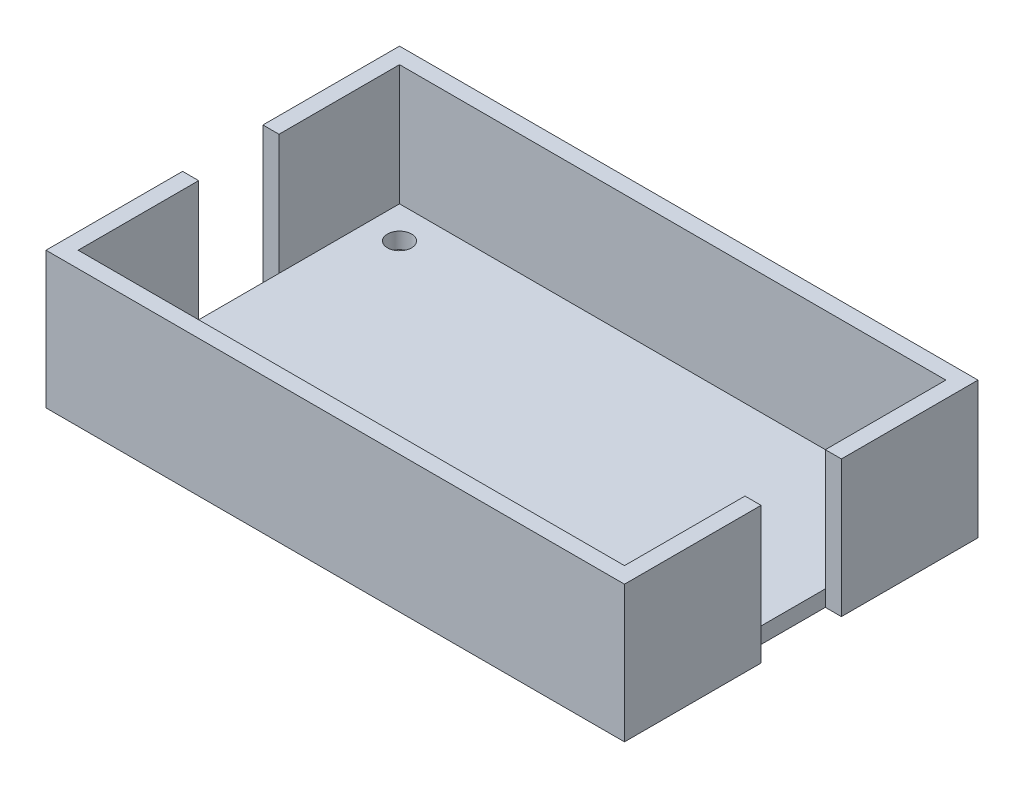
ISO-10303-21;
HEADER;
FILE_DESCRIPTION(('STEP AP214'),'2;1');
FILE_NAME('part.step','',(''),(''),'','','');
FILE_SCHEMA(('AUTOMOTIVE_DESIGN { 1 0 10303 214 1 1 1 1 }'));
ENDSEC;
DATA;
#1=APPLICATION_CONTEXT('core data for automotive mechanical design processes');
#2=APPLICATION_PROTOCOL_DEFINITION('international standard','automotive_design',2000,#1);
#3=PRODUCT_CONTEXT('',#1,'mechanical');
#4=PRODUCT('Part','Part','',(#3));
#5=PRODUCT_RELATED_PRODUCT_CATEGORY('part','',(#4));
#6=PRODUCT_DEFINITION_FORMATION('','',#4);
#7=PRODUCT_DEFINITION_CONTEXT('part definition',#1,'design');
#8=PRODUCT_DEFINITION('design','',#6,#7);
#9=PRODUCT_DEFINITION_SHAPE('','',#8);
#10=(LENGTH_UNIT() NAMED_UNIT(*) SI_UNIT(.MILLI.,.METRE.));
#11=(NAMED_UNIT(*) PLANE_ANGLE_UNIT() SI_UNIT($,.RADIAN.));
#12=(NAMED_UNIT(*) SI_UNIT($,.STERADIAN.) SOLID_ANGLE_UNIT());
#13=UNCERTAINTY_MEASURE_WITH_UNIT(LENGTH_MEASURE(1.E-05),#10,'distance_accuracy_value','');
#14=(GEOMETRIC_REPRESENTATION_CONTEXT(3) GLOBAL_UNCERTAINTY_ASSIGNED_CONTEXT((#13)) GLOBAL_UNIT_ASSIGNED_CONTEXT((#10,
#11,#12)) REPRESENTATION_CONTEXT('',''));
#15=CARTESIAN_POINT('',(0.,0.,0.));
#16=DIRECTION('',(0.,0.,1.));
#17=DIRECTION('',(1.,0.,0.));
#18=AXIS2_PLACEMENT_3D('',#15,#16,#17);
#19=CARTESIAN_POINT('',(72.,15.,0.));
#20=DIRECTION('',(1.,0.,0.));
#21=DIRECTION('',(0.,0.,-1.));
#22=AXIS2_PLACEMENT_3D('',#19,#20,#21);
#23=PLANE('',#22);
#24=DIRECTION('',(0.,-1.,0.));
#25=VECTOR('',#24,1.);
#26=CARTESIAN_POINT('',(72.,15.,27.));
#27=LINE('',#26,#25);
#28=CARTESIAN_POINT('',(72.,15.,27.));
#29=VERTEX_POINT('',#28);
#30=CARTESIAN_POINT('',(72.,-2.,27.));
#31=VERTEX_POINT('',#30);
#32=EDGE_CURVE('E324',#29,#31,#27,.T.);
#33=ORIENTED_EDGE('',*,*,#32,.F.);
#34=DIRECTION('',(0.,0.,1.));
#35=VECTOR('',#34,1.);
#36=CARTESIAN_POINT('',(72.,15.,0.));
#37=LINE('',#36,#35);
#38=CARTESIAN_POINT('',(72.,15.,44.));
#39=VERTEX_POINT('',#38);
#40=EDGE_CURVE('E263',#29,#39,#37,.T.);
#41=ORIENTED_EDGE('',*,*,#40,.T.);
#42=DIRECTION('',(0.,-1.,0.));
#43=VECTOR('',#42,1.);
#44=CARTESIAN_POINT('',(72.,15.,44.));
#45=LINE('',#44,#43);
#46=CARTESIAN_POINT('',(72.,-2.,44.));
#47=VERTEX_POINT('',#46);
#48=EDGE_CURVE('E287',#39,#47,#45,.T.);
#49=ORIENTED_EDGE('',*,*,#48,.T.);
#50=DIRECTION('',(0.,0.,1.));
#51=VECTOR('',#50,1.);
#52=CARTESIAN_POINT('',(72.,-2.,0.));
#53=LINE('',#52,#51);
#54=EDGE_CURVE('E237',#31,#47,#53,.T.);
#55=ORIENTED_EDGE('',*,*,#54,.F.);
#56=EDGE_LOOP('',(#33,#41,#49,#55));
#57=FACE_BOUND('',#56,.T.);
#58=ADVANCED_FACE('F35',(#57),#23,.T.);
#59=CARTESIAN_POINT('',(70.,15.,0.));
#60=DIRECTION('',(-1.,0.,0.));
#61=DIRECTION('',(0.,0.,1.));
#62=AXIS2_PLACEMENT_3D('',#59,#60,#61);
#63=PLANE('',#62);
#64=DIRECTION('',(0.,-1.,0.));
#65=VECTOR('',#64,1.);
#66=CARTESIAN_POINT('',(70.,15.,27.));
#67=LINE('',#66,#65);
#68=CARTESIAN_POINT('',(70.,15.,27.));
#69=VERTEX_POINT('',#68);
#70=CARTESIAN_POINT('',(70.,0.,27.));
#71=VERTEX_POINT('',#70);
#72=EDGE_CURVE('E179',#69,#71,#67,.T.);
#73=ORIENTED_EDGE('',*,*,#72,.T.);
#74=DIRECTION('',(0.,0.,-1.));
#75=VECTOR('',#74,1.);
#76=CARTESIAN_POINT('',(70.,0.,0.));
#77=LINE('',#76,#75);
#78=CARTESIAN_POINT('',(70.,0.,42.));
#79=VERTEX_POINT('',#78);
#80=EDGE_CURVE('E298',#79,#71,#77,.T.);
#81=ORIENTED_EDGE('',*,*,#80,.F.);
#82=DIRECTION('',(0.,-1.,0.));
#83=VECTOR('',#82,1.);
#84=CARTESIAN_POINT('',(70.,15.,42.));
#85=LINE('',#84,#83);
#86=CARTESIAN_POINT('',(70.,15.,42.));
#87=VERTEX_POINT('',#86);
#88=EDGE_CURVE('E301',#87,#79,#85,.T.);
#89=ORIENTED_EDGE('',*,*,#88,.F.);
#90=DIRECTION('',(0.,0.,-1.));
#91=VECTOR('',#90,1.);
#92=CARTESIAN_POINT('',(70.,15.,0.));
#93=LINE('',#92,#91);
#94=EDGE_CURVE('E284',#87,#69,#93,.T.);
#95=ORIENTED_EDGE('',*,*,#94,.T.);
#96=EDGE_LOOP('',(#73,#81,#89,#95));
#97=FACE_BOUND('',#96,.T.);
#98=ADVANCED_FACE('F388',(#97),#63,.T.);
#99=CARTESIAN_POINT('',(0.,15.,0.));
#100=DIRECTION('',(0.,1.,0.));
#101=DIRECTION('',(0.,0.,1.));
#102=AXIS2_PLACEMENT_3D('',#99,#100,#101);
#103=PLANE('',#102);
#104=DIRECTION('',(1.,0.,0.));
#105=VECTOR('',#104,1.);
#106=CARTESIAN_POINT('',(70.,15.,27.));
#107=LINE('',#106,#105);
#108=EDGE_CURVE('E189',#69,#29,#107,.T.);
#109=ORIENTED_EDGE('',*,*,#108,.F.);
#110=ORIENTED_EDGE('',*,*,#94,.F.);
#111=DIRECTION('',(-1.,0.,0.));
#112=VECTOR('',#111,1.);
#113=CARTESIAN_POINT('',(0.,15.,42.));
#114=LINE('',#113,#112);
#115=CARTESIAN_POINT('',(2.,15.,42.));
#116=VERTEX_POINT('',#115);
#117=EDGE_CURVE('E273',#87,#116,#114,.T.);
#118=ORIENTED_EDGE('',*,*,#117,.T.);
#119=DIRECTION('',(0.,0.,-1.));
#120=VECTOR('',#119,1.);
#121=CARTESIAN_POINT('',(2.,15.,0.));
#122=LINE('',#121,#120);
#123=CARTESIAN_POINT('',(2.,15.,27.));
#124=VERTEX_POINT('',#123);
#125=EDGE_CURVE('E277',#116,#124,#122,.T.);
#126=ORIENTED_EDGE('',*,*,#125,.T.);
#127=DIRECTION('',(-1.,0.,0.));
#128=VECTOR('',#127,1.);
#129=CARTESIAN_POINT('',(2.,15.,27.));
#130=LINE('',#129,#128);
#131=CARTESIAN_POINT('',(0.,15.,27.));
#132=VERTEX_POINT('',#131);
#133=EDGE_CURVE('E215',#124,#132,#130,.T.);
#134=ORIENTED_EDGE('',*,*,#133,.T.);
#135=DIRECTION('',(0.,0.,1.));
#136=VECTOR('',#135,1.);
#137=CARTESIAN_POINT('',(0.,15.,0.));
#138=LINE('',#137,#136);
#139=CARTESIAN_POINT('',(0.,15.,44.));
#140=VERTEX_POINT('',#139);
#141=EDGE_CURVE('E266',#132,#140,#138,.T.);
#142=ORIENTED_EDGE('',*,*,#141,.T.);
#143=DIRECTION('',(1.,0.,0.));
#144=VECTOR('',#143,1.);
#145=CARTESIAN_POINT('',(0.,15.,44.));
#146=LINE('',#145,#144);
#147=EDGE_CURVE('E270',#140,#39,#146,.T.);
#148=ORIENTED_EDGE('',*,*,#147,.T.);
#149=ORIENTED_EDGE('',*,*,#40,.F.);
#150=EDGE_LOOP('',(#109,#110,#118,#126,#134,#142,#148,#149));
#151=FACE_BOUND('',#150,.T.);
#152=ADVANCED_FACE('F337',(#151),#103,.T.);
#153=CARTESIAN_POINT('',(2.,15.,0.));
#154=DIRECTION('',(-1.,0.,0.));
#155=DIRECTION('',(0.,0.,1.));
#156=AXIS2_PLACEMENT_3D('',#153,#154,#155);
#157=PLANE('',#156);
#158=CARTESIAN_POINT('',(2.,15.,17.));
#159=VERTEX_POINT('',#158);
#160=CARTESIAN_POINT('',(2.,15.,2.00000000000001));
#161=VERTEX_POINT('',#160);
#162=EDGE_CURVE('E276',#159,#161,#122,.T.);
#163=ORIENTED_EDGE('',*,*,#162,.F.);
#164=DIRECTION('',(0.,-1.,0.));
#165=VECTOR('',#164,1.);
#166=CARTESIAN_POINT('',(2.,15.,17.));
#167=LINE('',#166,#165);
#168=CARTESIAN_POINT('',(2.,0.,17.));
#169=VERTEX_POINT('',#168);
#170=EDGE_CURVE('E198',#159,#169,#167,.T.);
#171=ORIENTED_EDGE('',*,*,#170,.T.);
#172=DIRECTION('',(0.,0.,-1.));
#173=VECTOR('',#172,1.);
#174=CARTESIAN_POINT('',(2.,0.,0.));
#175=LINE('',#174,#173);
#176=CARTESIAN_POINT('',(2.,0.,2.00000000000001));
#177=VERTEX_POINT('',#176);
#178=EDGE_CURVE('E290',#169,#177,#175,.T.);
#179=ORIENTED_EDGE('',*,*,#178,.T.);
#180=DIRECTION('',(0.,-1.,0.));
#181=VECTOR('',#180,1.);
#182=CARTESIAN_POINT('',(2.,15.,2.00000000000001));
#183=LINE('',#182,#181);
#184=EDGE_CURVE('E44',#161,#177,#183,.T.);
#185=ORIENTED_EDGE('',*,*,#184,.F.);
#186=EDGE_LOOP('',(#163,#171,#179,#185));
#187=FACE_BOUND('',#186,.T.);
#188=ADVANCED_FACE('F367',(#187),#157,.F.);
#189=CARTESIAN_POINT('',(0.,15.,0.));
#190=DIRECTION('',(1.,0.,0.));
#191=DIRECTION('',(0.,0.,-1.));
#192=AXIS2_PLACEMENT_3D('',#189,#190,#191);
#193=PLANE('',#192);
#194=DIRECTION('',(0.,0.,1.));
#195=VECTOR('',#194,1.);
#196=CARTESIAN_POINT('',(0.,-2.,0.));
#197=LINE('',#196,#195);
#198=CARTESIAN_POINT('',(0.,-2.,0.));
#199=VERTEX_POINT('',#198);
#200=CARTESIAN_POINT('',(0.,-2.,17.));
#201=VERTEX_POINT('',#200);
#202=EDGE_CURVE('E242',#199,#201,#197,.T.);
#203=ORIENTED_EDGE('',*,*,#202,.T.);
#204=DIRECTION('',(0.,-1.,0.));
#205=VECTOR('',#204,1.);
#206=CARTESIAN_POINT('',(0.,15.,17.));
#207=LINE('',#206,#205);
#208=CARTESIAN_POINT('',(0.,15.,17.));
#209=VERTEX_POINT('',#208);
#210=EDGE_CURVE('E197',#209,#201,#207,.T.);
#211=ORIENTED_EDGE('',*,*,#210,.F.);
#212=CARTESIAN_POINT('',(0.,15.,0.));
#213=VERTEX_POINT('',#212);
#214=EDGE_CURVE('E267',#213,#209,#138,.T.);
#215=ORIENTED_EDGE('',*,*,#214,.F.);
#216=DIRECTION('',(0.,-1.,0.));
#217=VECTOR('',#216,1.);
#218=CARTESIAN_POINT('',(0.,15.,0.));
#219=LINE('',#218,#217);
#220=EDGE_CURVE('E313',#213,#199,#219,.T.);
#221=ORIENTED_EDGE('',*,*,#220,.T.);
#222=EDGE_LOOP('',(#203,#211,#215,#221));
#223=FACE_BOUND('',#222,.T.);
#224=ADVANCED_FACE('F374',(#223),#193,.F.);
#225=CARTESIAN_POINT('',(0.,15.,42.));
#226=DIRECTION('',(0.,0.,1.));
#227=DIRECTION('',(1.,0.,0.));
#228=AXIS2_PLACEMENT_3D('',#225,#226,#227);
#229=PLANE('',#228);
#230=DIRECTION('',(-1.,0.,0.));
#231=VECTOR('',#230,1.);
#232=CARTESIAN_POINT('',(0.,0.,42.));
#233=LINE('',#232,#231);
#234=CARTESIAN_POINT('',(2.,0.,42.));
#235=VERTEX_POINT('',#234);
#236=EDGE_CURVE('E248',#79,#235,#233,.T.);
#237=ORIENTED_EDGE('',*,*,#236,.T.);
#238=DIRECTION('',(0.,-1.,0.));
#239=VECTOR('',#238,1.);
#240=CARTESIAN_POINT('',(2.,15.,42.));
#241=LINE('',#240,#239);
#242=EDGE_CURVE('E11',#116,#235,#241,.T.);
#243=ORIENTED_EDGE('',*,*,#242,.F.);
#244=ORIENTED_EDGE('',*,*,#117,.F.);
#245=ORIENTED_EDGE('',*,*,#88,.T.);
#246=EDGE_LOOP('',(#237,#243,#244,#245));
#247=FACE_BOUND('',#246,.T.);
#248=ADVANCED_FACE('F376',(#247),#229,.F.);
#249=CARTESIAN_POINT('',(2.,0.,27.));
#250=VERTEX_POINT('',#249);
#251=EDGE_CURVE('E291',#235,#250,#175,.T.);
#252=ORIENTED_EDGE('',*,*,#251,.T.);
#253=DIRECTION('',(0.,1.,0.));
#254=VECTOR('',#253,1.);
#255=CARTESIAN_POINT('',(2.,15.,27.));
#256=LINE('',#255,#254);
#257=EDGE_CURVE('E205',#250,#124,#256,.T.);
#258=ORIENTED_EDGE('',*,*,#257,.T.);
#259=ORIENTED_EDGE('',*,*,#125,.F.);
#260=ORIENTED_EDGE('',*,*,#242,.T.);
#261=EDGE_LOOP('',(#252,#258,#259,#260));
#262=FACE_BOUND('',#261,.T.);
#263=ADVANCED_FACE('F357',(#262),#157,.F.);
#264=CARTESIAN_POINT('',(0.,15.,2.00000000000001));
#265=DIRECTION('',(0.,0.,1.));
#266=DIRECTION('',(1.,0.,0.));
#267=AXIS2_PLACEMENT_3D('',#264,#265,#266);
#268=PLANE('',#267);
#269=DIRECTION('',(-1.,0.,0.));
#270=VECTOR('',#269,1.);
#271=CARTESIAN_POINT('',(0.,0.,2.00000000000001));
#272=LINE('',#271,#270);
#273=CARTESIAN_POINT('',(70.,0.,2.));
#274=VERTEX_POINT('',#273);
#275=EDGE_CURVE('E294',#274,#177,#272,.T.);
#276=ORIENTED_EDGE('',*,*,#275,.F.);
#277=DIRECTION('',(0.,-1.,0.));
#278=VECTOR('',#277,1.);
#279=CARTESIAN_POINT('',(70.,15.,2.));
#280=LINE('',#279,#278);
#281=CARTESIAN_POINT('',(70.,15.,2.));
#282=VERTEX_POINT('',#281);
#283=EDGE_CURVE('E304',#282,#274,#280,.T.);
#284=ORIENTED_EDGE('',*,*,#283,.F.);
#285=DIRECTION('',(-1.,0.,0.));
#286=VECTOR('',#285,1.);
#287=CARTESIAN_POINT('',(0.,15.,2.00000000000001));
#288=LINE('',#287,#286);
#289=EDGE_CURVE('E280',#282,#161,#288,.T.);
#290=ORIENTED_EDGE('',*,*,#289,.T.);
#291=ORIENTED_EDGE('',*,*,#184,.T.);
#292=EDGE_LOOP('',(#276,#284,#290,#291));
#293=FACE_BOUND('',#292,.T.);
#294=ADVANCED_FACE('F396',(#293),#268,.T.);
#295=DIRECTION('',(0.,1.,0.));
#296=VECTOR('',#295,1.);
#297=CARTESIAN_POINT('',(72.,15.,17.));
#298=LINE('',#297,#296);
#299=CARTESIAN_POINT('',(72.,-2.,17.));
#300=VERTEX_POINT('',#299);
#301=CARTESIAN_POINT('',(72.,15.,17.));
#302=VERTEX_POINT('',#301);
#303=EDGE_CURVE('E323',#300,#302,#298,.T.);
#304=ORIENTED_EDGE('',*,*,#303,.F.);
#305=CARTESIAN_POINT('',(72.,-2.,0.));
#306=VERTEX_POINT('',#305);
#307=EDGE_CURVE('E185',#306,#300,#53,.T.);
#308=ORIENTED_EDGE('',*,*,#307,.F.);
#309=DIRECTION('',(0.,-1.,0.));
#310=VECTOR('',#309,1.);
#311=CARTESIAN_POINT('',(72.,15.,0.));
#312=LINE('',#311,#310);
#313=CARTESIAN_POINT('',(72.,15.,0.));
#314=VERTEX_POINT('',#313);
#315=EDGE_CURVE('E39',#314,#306,#312,.T.);
#316=ORIENTED_EDGE('',*,*,#315,.F.);
#317=EDGE_CURVE('E259',#314,#302,#37,.T.);
#318=ORIENTED_EDGE('',*,*,#317,.T.);
#319=EDGE_LOOP('',(#304,#308,#316,#318));
#320=FACE_BOUND('',#319,.T.);
#321=ADVANCED_FACE('F37',(#320),#23,.T.);
#322=CARTESIAN_POINT('',(0.,15.,0.));
#323=DIRECTION('',(0.,0.,-1.));
#324=DIRECTION('',(-1.,0.,0.));
#325=AXIS2_PLACEMENT_3D('',#322,#323,#324);
#326=PLANE('',#325);
#327=ORIENTED_EDGE('',*,*,#315,.T.);
#328=DIRECTION('',(1.,0.,0.));
#329=VECTOR('',#328,1.);
#330=CARTESIAN_POINT('',(0.,-2.,0.));
#331=LINE('',#330,#329);
#332=EDGE_CURVE('E239',#199,#306,#331,.T.);
#333=ORIENTED_EDGE('',*,*,#332,.F.);
#334=ORIENTED_EDGE('',*,*,#220,.F.);
#335=DIRECTION('',(1.,0.,0.));
#336=VECTOR('',#335,1.);
#337=CARTESIAN_POINT('',(0.,15.,0.));
#338=LINE('',#337,#336);
#339=EDGE_CURVE('E262',#213,#314,#338,.T.);
#340=ORIENTED_EDGE('',*,*,#339,.T.);
#341=EDGE_LOOP('',(#327,#333,#334,#340));
#342=FACE_BOUND('',#341,.T.);
#343=ADVANCED_FACE('F318',(#342),#326,.T.);
#344=ORIENTED_EDGE('',*,*,#141,.F.);
#345=DIRECTION('',(0.,1.,0.));
#346=VECTOR('',#345,1.);
#347=CARTESIAN_POINT('',(0.,15.,27.));
#348=LINE('',#347,#346);
#349=CARTESIAN_POINT('',(0.,-2.,27.));
#350=VERTEX_POINT('',#349);
#351=EDGE_CURVE('E210',#350,#132,#348,.T.);
#352=ORIENTED_EDGE('',*,*,#351,.F.);
#353=CARTESIAN_POINT('',(0.,-2.,44.));
#354=VERTEX_POINT('',#353);
#355=EDGE_CURVE('E241',#350,#354,#197,.T.);
#356=ORIENTED_EDGE('',*,*,#355,.T.);
#357=DIRECTION('',(0.,-1.,0.));
#358=VECTOR('',#357,1.);
#359=CARTESIAN_POINT('',(0.,15.,44.));
#360=LINE('',#359,#358);
#361=EDGE_CURVE('E311',#140,#354,#360,.T.);
#362=ORIENTED_EDGE('',*,*,#361,.F.);
#363=EDGE_LOOP('',(#344,#352,#356,#362));
#364=FACE_BOUND('',#363,.T.);
#365=ADVANCED_FACE('F350',(#364),#193,.F.);
#366=CARTESIAN_POINT('',(0.,15.,44.));
#367=DIRECTION('',(0.,0.,-1.));
#368=DIRECTION('',(-1.,0.,0.));
#369=AXIS2_PLACEMENT_3D('',#366,#367,#368);
#370=PLANE('',#369);
#371=ORIENTED_EDGE('',*,*,#361,.T.);
#372=DIRECTION('',(1.,0.,0.));
#373=VECTOR('',#372,1.);
#374=CARTESIAN_POINT('',(0.,-2.,44.));
#375=LINE('',#374,#373);
#376=EDGE_CURVE('E245',#354,#47,#375,.T.);
#377=ORIENTED_EDGE('',*,*,#376,.T.);
#378=ORIENTED_EDGE('',*,*,#48,.F.);
#379=ORIENTED_EDGE('',*,*,#147,.F.);
#380=EDGE_LOOP('',(#371,#377,#378,#379));
#381=FACE_BOUND('',#380,.T.);
#382=ADVANCED_FACE('F343',(#381),#370,.F.);
#383=DIRECTION('',(0.,1.,0.));
#384=VECTOR('',#383,1.);
#385=CARTESIAN_POINT('',(70.,15.,17.));
#386=LINE('',#385,#384);
#387=CARTESIAN_POINT('',(70.,0.,17.));
#388=VERTEX_POINT('',#387);
#389=CARTESIAN_POINT('',(70.,15.,17.));
#390=VERTEX_POINT('',#389);
#391=EDGE_CURVE('E170',#388,#390,#386,.T.);
#392=ORIENTED_EDGE('',*,*,#391,.T.);
#393=EDGE_CURVE('E283',#390,#282,#93,.T.);
#394=ORIENTED_EDGE('',*,*,#393,.T.);
#395=ORIENTED_EDGE('',*,*,#283,.T.);
#396=EDGE_CURVE('E297',#388,#274,#77,.T.);
#397=ORIENTED_EDGE('',*,*,#396,.F.);
#398=EDGE_LOOP('',(#392,#394,#395,#397));
#399=FACE_BOUND('',#398,.T.);
#400=ADVANCED_FACE('F394',(#399),#63,.T.);
#401=DIRECTION('',(1.,0.,0.));
#402=VECTOR('',#401,1.);
#403=CARTESIAN_POINT('',(70.,15.,17.));
#404=LINE('',#403,#402);
#405=EDGE_CURVE('E186',#390,#302,#404,.T.);
#406=ORIENTED_EDGE('',*,*,#405,.T.);
#407=ORIENTED_EDGE('',*,*,#317,.F.);
#408=ORIENTED_EDGE('',*,*,#339,.F.);
#409=ORIENTED_EDGE('',*,*,#214,.T.);
#410=DIRECTION('',(-1.,0.,0.));
#411=VECTOR('',#410,1.);
#412=CARTESIAN_POINT('',(2.,15.,17.));
#413=LINE('',#412,#411);
#414=EDGE_CURVE('E212',#159,#209,#413,.T.);
#415=ORIENTED_EDGE('',*,*,#414,.F.);
#416=ORIENTED_EDGE('',*,*,#162,.T.);
#417=ORIENTED_EDGE('',*,*,#289,.F.);
#418=ORIENTED_EDGE('',*,*,#393,.F.);
#419=EDGE_LOOP('',(#406,#407,#408,#409,#415,#416,#417,#418));
#420=FACE_BOUND('',#419,.T.);
#421=ADVANCED_FACE('F372',(#420),#103,.T.);
#422=CARTESIAN_POINT('',(0.,0.,0.));
#423=DIRECTION('',(0.,1.,0.));
#424=DIRECTION('',(0.,0.,1.));
#425=AXIS2_PLACEMENT_3D('',#422,#423,#424);
#426=PLANE('',#425);
#427=CARTESIAN_POINT('',(66.,0.,38.));
#428=DIRECTION('',(0.,1.,0.));
#429=DIRECTION('',(0.,0.,1.));
#430=AXIS2_PLACEMENT_3D('',#427,#428,#429);
#431=CIRCLE('',#430,1.5);
#432=CARTESIAN_POINT('',(66.,0.,39.5));
#433=VERTEX_POINT('',#432);
#434=EDGE_CURVE('E228',#433,#433,#431,.T.);
#435=ORIENTED_EDGE('',*,*,#434,.F.);
#436=EDGE_LOOP('',(#435));
#437=FACE_BOUND('',#436,.T.);
#438=CARTESIAN_POINT('',(5.99999999999999,0.,38.0000000000004));
#439=DIRECTION('',(0.,1.,0.));
#440=DIRECTION('',(0.,0.,1.));
#441=AXIS2_PLACEMENT_3D('',#438,#439,#440);
#442=CIRCLE('',#441,1.5);
#443=CARTESIAN_POINT('',(5.99999999999999,0.,39.5000000000004));
#444=VERTEX_POINT('',#443);
#445=EDGE_CURVE('E254',#444,#444,#442,.T.);
#446=ORIENTED_EDGE('',*,*,#445,.F.);
#447=EDGE_LOOP('',(#446));
#448=FACE_BOUND('',#447,.T.);
#449=CARTESIAN_POINT('',(5.99999999999988,0.,6.00000000000041));
#450=DIRECTION('',(0.,1.,0.));
#451=DIRECTION('',(0.,0.,1.));
#452=AXIS2_PLACEMENT_3D('',#449,#450,#451);
#453=CIRCLE('',#452,1.5);
#454=CARTESIAN_POINT('',(5.99999999999988,0.,7.50000000000041));
#455=VERTEX_POINT('',#454);
#456=EDGE_CURVE('E251',#455,#455,#453,.T.);
#457=ORIENTED_EDGE('',*,*,#456,.F.);
#458=EDGE_LOOP('',(#457));
#459=FACE_BOUND('',#458,.T.);
#460=CARTESIAN_POINT('',(65.9999999999999,0.,5.99999999999999));
#461=DIRECTION('',(0.,1.,0.));
#462=DIRECTION('',(0.,0.,1.));
#463=AXIS2_PLACEMENT_3D('',#460,#461,#462);
#464=CIRCLE('',#463,1.5);
#465=CARTESIAN_POINT('',(65.9999999999999,0.,7.49999999999999));
#466=VERTEX_POINT('',#465);
#467=EDGE_CURVE('E223',#466,#466,#464,.T.);
#468=ORIENTED_EDGE('',*,*,#467,.F.);
#469=EDGE_LOOP('',(#468));
#470=FACE_BOUND('',#469,.T.);
#471=ORIENTED_EDGE('',*,*,#236,.F.);
#472=ORIENTED_EDGE('',*,*,#80,.T.);
#473=DIRECTION('',(0.,0.,-1.));
#474=VECTOR('',#473,1.);
#475=CARTESIAN_POINT('',(70.,0.,0.));
#476=LINE('',#475,#474);
#477=EDGE_CURVE('E194',#71,#388,#476,.T.);
#478=ORIENTED_EDGE('',*,*,#477,.T.);
#479=ORIENTED_EDGE('',*,*,#396,.T.);
#480=ORIENTED_EDGE('',*,*,#275,.T.);
#481=ORIENTED_EDGE('',*,*,#178,.F.);
#482=DIRECTION('',(0.,0.,1.));
#483=VECTOR('',#482,1.);
#484=CARTESIAN_POINT('',(2.,0.,0.));
#485=LINE('',#484,#483);
#486=EDGE_CURVE('E214',#169,#250,#485,.T.);
#487=ORIENTED_EDGE('',*,*,#486,.T.);
#488=ORIENTED_EDGE('',*,*,#251,.F.);
#489=EDGE_LOOP('',(#471,#472,#478,#479,#480,#481,#487,#488));
#490=FACE_BOUND('',#489,.T.);
#491=ADVANCED_FACE('F362',(#437,#448,#459,#470,#490),#426,.T.);
#492=CARTESIAN_POINT('',(66.,-2.,38.));
#493=DIRECTION('',(0.,1.,0.));
#494=DIRECTION('',(0.,0.,1.));
#495=AXIS2_PLACEMENT_3D('',#492,#493,#494);
#496=CYLINDRICAL_SURFACE('',#495,1.5);
#497=CARTESIAN_POINT('',(66.,-2.,38.));
#498=DIRECTION('',(0.,1.,0.));
#499=DIRECTION('',(0.,0.,1.));
#500=AXIS2_PLACEMENT_3D('',#497,#498,#499);
#501=CIRCLE('',#500,1.5);
#502=CARTESIAN_POINT('',(66.,-2.,39.5));
#503=VERTEX_POINT('',#502);
#504=EDGE_CURVE('E234',#503,#503,#501,.T.);
#505=ORIENTED_EDGE('',*,*,#504,.F.);
#506=EDGE_LOOP('',(#505));
#507=FACE_BOUND('',#506,.T.);
#508=ORIENTED_EDGE('',*,*,#434,.T.);
#509=EDGE_LOOP('',(#508));
#510=FACE_BOUND('',#509,.T.);
#511=ADVANCED_FACE('F421',(#507,#510),#496,.F.);
#512=CARTESIAN_POINT('',(5.99999999999999,-2.,38.0000000000004));
#513=DIRECTION('',(0.,1.,0.));
#514=DIRECTION('',(0.,0.,1.));
#515=AXIS2_PLACEMENT_3D('',#512,#513,#514);
#516=CYLINDRICAL_SURFACE('',#515,1.5);
#517=CARTESIAN_POINT('',(5.99999999999999,-2.,38.0000000000004));
#518=DIRECTION('',(0.,1.,0.));
#519=DIRECTION('',(0.,0.,1.));
#520=AXIS2_PLACEMENT_3D('',#517,#518,#519);
#521=CIRCLE('',#520,1.5);
#522=CARTESIAN_POINT('',(5.99999999999999,-2.,39.5000000000004));
#523=VERTEX_POINT('',#522);
#524=EDGE_CURVE('E231',#523,#523,#521,.T.);
#525=ORIENTED_EDGE('',*,*,#524,.F.);
#526=EDGE_LOOP('',(#525));
#527=FACE_BOUND('',#526,.T.);
#528=ORIENTED_EDGE('',*,*,#445,.T.);
#529=EDGE_LOOP('',(#528));
#530=FACE_BOUND('',#529,.T.);
#531=ADVANCED_FACE('F534',(#527,#530),#516,.F.);
#532=CARTESIAN_POINT('',(5.99999999999988,-2.,6.00000000000041));
#533=DIRECTION('',(0.,1.,0.));
#534=DIRECTION('',(0.,0.,1.));
#535=AXIS2_PLACEMENT_3D('',#532,#533,#534);
#536=CYLINDRICAL_SURFACE('',#535,1.5);
#537=CARTESIAN_POINT('',(5.99999999999988,-2.,6.00000000000041));
#538=DIRECTION('',(0.,1.,0.));
#539=DIRECTION('',(0.,0.,1.));
#540=AXIS2_PLACEMENT_3D('',#537,#538,#539);
#541=CIRCLE('',#540,1.5);
#542=CARTESIAN_POINT('',(5.99999999999988,-2.,7.50000000000041));
#543=VERTEX_POINT('',#542);
#544=EDGE_CURVE('E227',#543,#543,#541,.T.);
#545=ORIENTED_EDGE('',*,*,#544,.F.);
#546=EDGE_LOOP('',(#545));
#547=FACE_BOUND('',#546,.T.);
#548=ORIENTED_EDGE('',*,*,#456,.T.);
#549=EDGE_LOOP('',(#548));
#550=FACE_BOUND('',#549,.T.);
#551=ADVANCED_FACE('F538',(#547,#550),#536,.F.);
#552=CARTESIAN_POINT('',(65.9999999999999,-2.,5.99999999999999));
#553=DIRECTION('',(0.,1.,0.));
#554=DIRECTION('',(0.,0.,1.));
#555=AXIS2_PLACEMENT_3D('',#552,#553,#554);
#556=CYLINDRICAL_SURFACE('',#555,1.5);
#557=CARTESIAN_POINT('',(65.9999999999999,-2.,5.99999999999999));
#558=DIRECTION('',(0.,1.,0.));
#559=DIRECTION('',(0.,0.,1.));
#560=AXIS2_PLACEMENT_3D('',#557,#558,#559);
#561=CIRCLE('',#560,1.5);
#562=CARTESIAN_POINT('',(65.9999999999999,-2.,7.49999999999999));
#563=VERTEX_POINT('',#562);
#564=EDGE_CURVE('E224',#563,#563,#561,.T.);
#565=ORIENTED_EDGE('',*,*,#564,.F.);
#566=EDGE_LOOP('',(#565));
#567=FACE_BOUND('',#566,.T.);
#568=ORIENTED_EDGE('',*,*,#467,.T.);
#569=EDGE_LOOP('',(#568));
#570=FACE_BOUND('',#569,.T.);
#571=ADVANCED_FACE('F441',(#567,#570),#556,.F.);
#572=CARTESIAN_POINT('',(0.,-2.,0.));
#573=DIRECTION('',(0.,1.,0.));
#574=DIRECTION('',(0.,0.,1.));
#575=AXIS2_PLACEMENT_3D('',#572,#573,#574);
#576=PLANE('',#575);
#577=ORIENTED_EDGE('',*,*,#564,.T.);
#578=EDGE_LOOP('',(#577));
#579=FACE_BOUND('',#578,.T.);
#580=ORIENTED_EDGE('',*,*,#544,.T.);
#581=EDGE_LOOP('',(#580));
#582=FACE_BOUND('',#581,.T.);
#583=ORIENTED_EDGE('',*,*,#524,.T.);
#584=EDGE_LOOP('',(#583));
#585=FACE_BOUND('',#584,.T.);
#586=ORIENTED_EDGE('',*,*,#504,.T.);
#587=EDGE_LOOP('',(#586));
#588=FACE_BOUND('',#587,.T.);
#589=DIRECTION('',(0.,0.,-1.));
#590=VECTOR('',#589,1.);
#591=CARTESIAN_POINT('',(70.,-2.,27.));
#592=LINE('',#591,#590);
#593=CARTESIAN_POINT('',(70.,-2.,27.));
#594=VERTEX_POINT('',#593);
#595=CARTESIAN_POINT('',(70.,-2.,17.));
#596=VERTEX_POINT('',#595);
#597=EDGE_CURVE('E175',#594,#596,#592,.T.);
#598=ORIENTED_EDGE('',*,*,#597,.F.);
#599=DIRECTION('',(1.,0.,0.));
#600=VECTOR('',#599,1.);
#601=CARTESIAN_POINT('',(70.,-2.,27.));
#602=LINE('',#601,#600);
#603=EDGE_CURVE('E52',#594,#31,#602,.T.);
#604=ORIENTED_EDGE('',*,*,#603,.T.);
#605=ORIENTED_EDGE('',*,*,#54,.T.);
#606=ORIENTED_EDGE('',*,*,#376,.F.);
#607=ORIENTED_EDGE('',*,*,#355,.F.);
#608=DIRECTION('',(-1.,0.,0.));
#609=VECTOR('',#608,1.);
#610=CARTESIAN_POINT('',(2.,-2.,27.));
#611=LINE('',#610,#609);
#612=CARTESIAN_POINT('',(2.,-2.,27.));
#613=VERTEX_POINT('',#612);
#614=EDGE_CURVE('E218',#613,#350,#611,.T.);
#615=ORIENTED_EDGE('',*,*,#614,.F.);
#616=DIRECTION('',(0.,0.,1.));
#617=VECTOR('',#616,1.);
#618=CARTESIAN_POINT('',(2.,-2.,17.));
#619=LINE('',#618,#617);
#620=CARTESIAN_POINT('',(2.,-2.,17.));
#621=VERTEX_POINT('',#620);
#622=EDGE_CURVE('E201',#621,#613,#619,.T.);
#623=ORIENTED_EDGE('',*,*,#622,.F.);
#624=DIRECTION('',(-1.,0.,0.));
#625=VECTOR('',#624,1.);
#626=CARTESIAN_POINT('',(2.,-2.,17.));
#627=LINE('',#626,#625);
#628=EDGE_CURVE('E60',#621,#201,#627,.T.);
#629=ORIENTED_EDGE('',*,*,#628,.T.);
#630=ORIENTED_EDGE('',*,*,#202,.F.);
#631=ORIENTED_EDGE('',*,*,#332,.T.);
#632=ORIENTED_EDGE('',*,*,#307,.T.);
#633=DIRECTION('',(1.,0.,0.));
#634=VECTOR('',#633,1.);
#635=CARTESIAN_POINT('',(70.,-2.,17.));
#636=LINE('',#635,#634);
#637=EDGE_CURVE('E167',#596,#300,#636,.T.);
#638=ORIENTED_EDGE('',*,*,#637,.F.);
#639=EDGE_LOOP('',(#598,#604,#605,#606,#607,#615,#623,#629,#630,#631,#632,#638));
#640=FACE_BOUND('',#639,.T.);
#641=ADVANCED_FACE('F182',(#579,#582,#585,#588,#640),#576,.F.);
#642=CARTESIAN_POINT('',(2.,15.,17.));
#643=DIRECTION('',(0.,0.,-1.));
#644=DIRECTION('',(0.,1.,0.));
#645=AXIS2_PLACEMENT_3D('',#642,#643,#644);
#646=PLANE('',#645);
#647=ORIENTED_EDGE('',*,*,#210,.T.);
#648=ORIENTED_EDGE('',*,*,#628,.F.);
#649=EDGE_CURVE('E202',#169,#621,#167,.T.);
#650=ORIENTED_EDGE('',*,*,#649,.F.);
#651=ORIENTED_EDGE('',*,*,#170,.F.);
#652=ORIENTED_EDGE('',*,*,#414,.T.);
#653=EDGE_LOOP('',(#647,#648,#650,#651,#652));
#654=FACE_BOUND('',#653,.T.);
#655=ADVANCED_FACE('F369',(#654),#646,.F.);
#656=CARTESIAN_POINT('',(2.,15.,27.));
#657=DIRECTION('',(0.,0.,1.));
#658=DIRECTION('',(0.,-1.,0.));
#659=AXIS2_PLACEMENT_3D('',#656,#657,#658);
#660=PLANE('',#659);
#661=ORIENTED_EDGE('',*,*,#351,.T.);
#662=ORIENTED_EDGE('',*,*,#133,.F.);
#663=ORIENTED_EDGE('',*,*,#257,.F.);
#664=EDGE_CURVE('E206',#613,#250,#256,.T.);
#665=ORIENTED_EDGE('',*,*,#664,.F.);
#666=ORIENTED_EDGE('',*,*,#614,.T.);
#667=EDGE_LOOP('',(#661,#662,#663,#665,#666));
#668=FACE_BOUND('',#667,.T.);
#669=ADVANCED_FACE('F352',(#668),#660,.F.);
#670=CARTESIAN_POINT('',(2.,0.,0.));
#671=DIRECTION('',(-1.,0.,0.));
#672=DIRECTION('',(0.,0.,1.));
#673=AXIS2_PLACEMENT_3D('',#670,#671,#672);
#674=PLANE('',#673);
#675=ORIENTED_EDGE('',*,*,#649,.T.);
#676=ORIENTED_EDGE('',*,*,#622,.T.);
#677=ORIENTED_EDGE('',*,*,#664,.T.);
#678=ORIENTED_EDGE('',*,*,#486,.F.);
#679=EDGE_LOOP('',(#675,#676,#677,#678));
#680=FACE_BOUND('',#679,.T.);
#681=ADVANCED_FACE('F359',(#680),#674,.T.);
#682=CARTESIAN_POINT('',(70.,15.,27.));
#683=DIRECTION('',(0.,0.,1.));
#684=DIRECTION('',(0.,-1.,0.));
#685=AXIS2_PLACEMENT_3D('',#682,#683,#684);
#686=PLANE('',#685);
#687=ORIENTED_EDGE('',*,*,#32,.T.);
#688=ORIENTED_EDGE('',*,*,#603,.F.);
#689=EDGE_CURVE('E177',#71,#594,#67,.T.);
#690=ORIENTED_EDGE('',*,*,#689,.F.);
#691=ORIENTED_EDGE('',*,*,#72,.F.);
#692=ORIENTED_EDGE('',*,*,#108,.T.);
#693=EDGE_LOOP('',(#687,#688,#690,#691,#692));
#694=FACE_BOUND('',#693,.T.);
#695=ADVANCED_FACE('F330',(#694),#686,.F.);
#696=CARTESIAN_POINT('',(70.,15.,17.));
#697=DIRECTION('',(0.,0.,-1.));
#698=DIRECTION('',(0.,1.,0.));
#699=AXIS2_PLACEMENT_3D('',#696,#697,#698);
#700=PLANE('',#699);
#701=ORIENTED_EDGE('',*,*,#303,.T.);
#702=ORIENTED_EDGE('',*,*,#405,.F.);
#703=ORIENTED_EDGE('',*,*,#391,.F.);
#704=EDGE_CURVE('E163',#596,#388,#386,.T.);
#705=ORIENTED_EDGE('',*,*,#704,.F.);
#706=ORIENTED_EDGE('',*,*,#637,.T.);
#707=EDGE_LOOP('',(#701,#702,#703,#705,#706));
#708=FACE_BOUND('',#707,.T.);
#709=ADVANCED_FACE('F165',(#708),#700,.F.);
#710=CARTESIAN_POINT('',(70.,0.,0.));
#711=DIRECTION('',(1.,0.,0.));
#712=DIRECTION('',(0.,0.,-1.));
#713=AXIS2_PLACEMENT_3D('',#710,#711,#712);
#714=PLANE('',#713);
#715=ORIENTED_EDGE('',*,*,#689,.T.);
#716=ORIENTED_EDGE('',*,*,#597,.T.);
#717=ORIENTED_EDGE('',*,*,#704,.T.);
#718=ORIENTED_EDGE('',*,*,#477,.F.);
#719=EDGE_LOOP('',(#715,#716,#717,#718));
#720=FACE_BOUND('',#719,.T.);
#721=ADVANCED_FACE('F176',(#720),#714,.T.);
#722=CLOSED_SHELL('',(#58,#98,#152,#188,#224,#248,#263,#294,#321,#343,#365,#382,#400,#421,#491,
#511,#531,#551,#571,#641,#655,#669,#681,#695,#709,#721));
#723=MANIFOLD_SOLID_BREP('B2',#722);
#724=ADVANCED_BREP_SHAPE_REPRESENTATION('',(#18,#723),#14);
#725=SHAPE_DEFINITION_REPRESENTATION(#9,#724);
ENDSEC;
END-ISO-10303-21;
